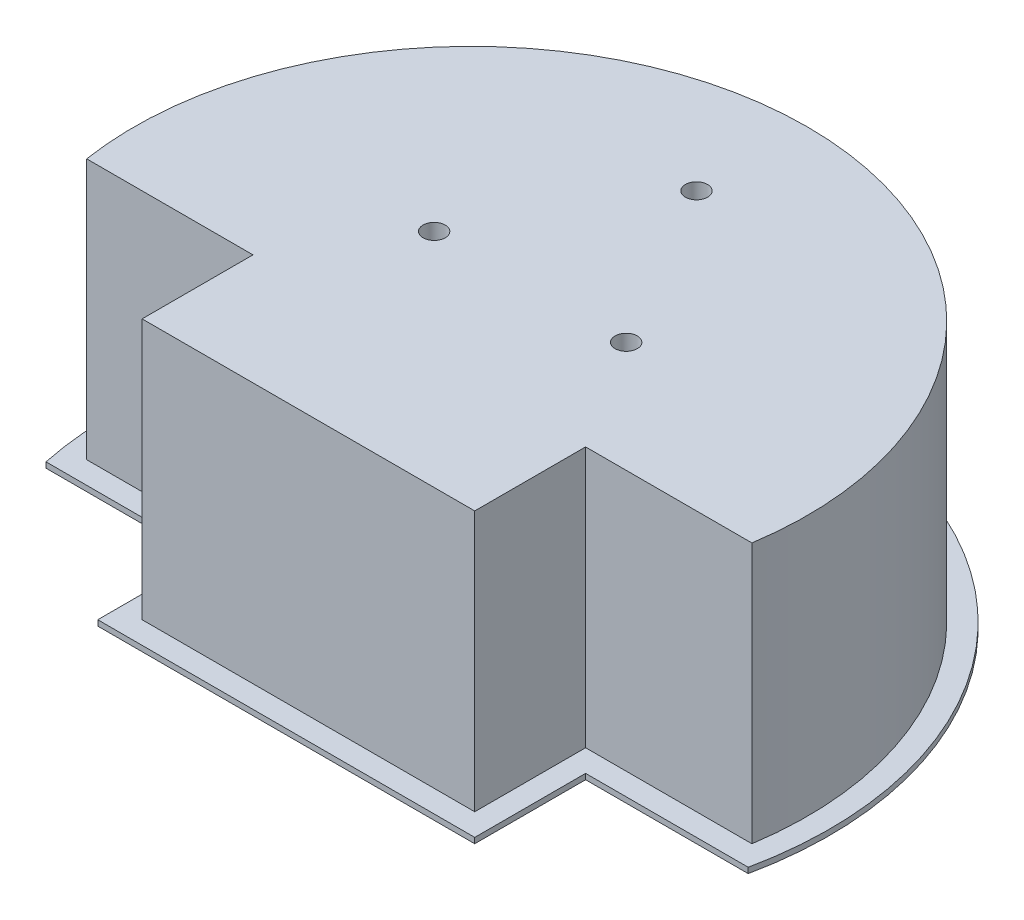
ISO-10303-21;
HEADER;
FILE_DESCRIPTION(('STEP AP214'),'2;1');
FILE_NAME('part.step','',(''),(''),'','','');
FILE_SCHEMA(('AUTOMOTIVE_DESIGN { 1 0 10303 214 1 1 1 1 }'));
ENDSEC;
DATA;
#1=APPLICATION_CONTEXT('core data for automotive mechanical design processes');
#2=APPLICATION_PROTOCOL_DEFINITION('international standard','automotive_design',2000,#1);
#3=PRODUCT_CONTEXT('',#1,'mechanical');
#4=PRODUCT('Part','Part','',(#3));
#5=PRODUCT_RELATED_PRODUCT_CATEGORY('part','',(#4));
#6=PRODUCT_DEFINITION_FORMATION('','',#4);
#7=PRODUCT_DEFINITION_CONTEXT('part definition',#1,'design');
#8=PRODUCT_DEFINITION('design','',#6,#7);
#9=PRODUCT_DEFINITION_SHAPE('','',#8);
#10=(LENGTH_UNIT() NAMED_UNIT(*) SI_UNIT(.MILLI.,.METRE.));
#11=(NAMED_UNIT(*) PLANE_ANGLE_UNIT() SI_UNIT($,.RADIAN.));
#12=(NAMED_UNIT(*) SI_UNIT($,.STERADIAN.) SOLID_ANGLE_UNIT());
#13=UNCERTAINTY_MEASURE_WITH_UNIT(LENGTH_MEASURE(1.E-05),#10,'distance_accuracy_value','');
#14=(GEOMETRIC_REPRESENTATION_CONTEXT(3) GLOBAL_UNCERTAINTY_ASSIGNED_CONTEXT((#13)) GLOBAL_UNIT_ASSIGNED_CONTEXT((#10,
#11,#12)) REPRESENTATION_CONTEXT('',''));
#15=CARTESIAN_POINT('',(0.,0.,0.));
#16=DIRECTION('',(0.,0.,1.));
#17=DIRECTION('',(1.,0.,0.));
#18=AXIS2_PLACEMENT_3D('',#15,#16,#17);
#19=CARTESIAN_POINT('',(0.,0.,-14.6428571428571));
#20=DIRECTION('',(0.,1.,0.));
#21=DIRECTION('',(0.,0.,1.));
#22=AXIS2_PLACEMENT_3D('',#19,#20,#21);
#23=PLANE('',#22);
#24=DIRECTION('',(0.,0.,1.));
#25=VECTOR('',#24,1.);
#26=CARTESIAN_POINT('',(-13.,0.,-14.6428571428571));
#27=LINE('',#26,#25);
#28=CARTESIAN_POINT('',(-13.,0.,-12.));
#29=VERTEX_POINT('',#28);
#30=CARTESIAN_POINT('',(-13.,0.,-2.));
#31=VERTEX_POINT('',#30);
#32=EDGE_CURVE('E355',#29,#31,#27,.T.);
#33=ORIENTED_EDGE('',*,*,#32,.T.);
#34=DIRECTION('',(1.,0.,0.));
#35=VECTOR('',#34,1.);
#36=CARTESIAN_POINT('',(0.,0.,-2.));
#37=LINE('',#36,#35);
#38=CARTESIAN_POINT('',(13.,0.,-2.));
#39=VERTEX_POINT('',#38);
#40=EDGE_CURVE('E385',#31,#39,#37,.T.);
#41=ORIENTED_EDGE('',*,*,#40,.T.);
#42=DIRECTION('',(0.,0.,-1.));
#43=VECTOR('',#42,1.);
#44=CARTESIAN_POINT('',(13.,0.,-14.6428571428571));
#45=LINE('',#44,#43);
#46=CARTESIAN_POINT('',(13.,0.,-12.));
#47=VERTEX_POINT('',#46);
#48=EDGE_CURVE('E389',#39,#47,#45,.T.);
#49=ORIENTED_EDGE('',*,*,#48,.T.);
#50=DIRECTION('',(1.,0.,0.));
#51=VECTOR('',#50,1.);
#52=CARTESIAN_POINT('',(0.,0.,-12.));
#53=LINE('',#52,#51);
#54=CARTESIAN_POINT('',(28.2337184434296,0.,-12.));
#55=VERTEX_POINT('',#54);
#56=EDGE_CURVE('E393',#47,#55,#53,.T.);
#57=ORIENTED_EDGE('',*,*,#56,.T.);
#58=CARTESIAN_POINT('',(0.,0.,-14.6428571428571));
#59=DIRECTION('',(0.,-1.,0.));
#60=DIRECTION('',(-1.,0.,0.));
#61=AXIS2_PLACEMENT_3D('',#58,#59,#60);
#62=CIRCLE('',#61,28.3571428571429);
#63=CARTESIAN_POINT('',(-28.2337184434296,0.,-12.));
#64=VERTEX_POINT('',#63);
#65=EDGE_CURVE('E397',#55,#64,#62,.F.);
#66=ORIENTED_EDGE('',*,*,#65,.T.);
#67=DIRECTION('',(1.,0.,0.));
#68=VECTOR('',#67,1.);
#69=CARTESIAN_POINT('',(0.,0.,-12.));
#70=LINE('',#69,#68);
#71=EDGE_CURVE('E361',#64,#29,#70,.T.);
#72=ORIENTED_EDGE('',*,*,#71,.T.);
#73=EDGE_LOOP('',(#33,#41,#49,#57,#66,#72));
#74=FACE_BOUND('',#73,.T.);
#75=DIRECTION('',(0.,0.,1.));
#76=VECTOR('',#75,1.);
#77=CARTESIAN_POINT('',(17.,0.,-8.00000000000001));
#78=LINE('',#77,#76);
#79=CARTESIAN_POINT('',(17.,0.,-8.00000000000001));
#80=VERTEX_POINT('',#79);
#81=CARTESIAN_POINT('',(17.,0.,2.));
#82=VERTEX_POINT('',#81);
#83=EDGE_CURVE('E258',#80,#82,#78,.T.);
#84=ORIENTED_EDGE('',*,*,#83,.T.);
#85=DIRECTION('',(-1.,0.,0.));
#86=VECTOR('',#85,1.);
#87=CARTESIAN_POINT('',(17.,0.,2.));
#88=LINE('',#87,#86);
#89=CARTESIAN_POINT('',(-17.,0.,2.));
#90=VERTEX_POINT('',#89);
#91=EDGE_CURVE('E211',#82,#90,#88,.T.);
#92=ORIENTED_EDGE('',*,*,#91,.T.);
#93=DIRECTION('',(0.,0.,-1.));
#94=VECTOR('',#93,1.);
#95=CARTESIAN_POINT('',(-17.,0.,2.));
#96=LINE('',#95,#94);
#97=CARTESIAN_POINT('',(-17.,0.,-8.));
#98=VERTEX_POINT('',#97);
#99=EDGE_CURVE('E263',#90,#98,#96,.T.);
#100=ORIENTED_EDGE('',*,*,#99,.T.);
#101=DIRECTION('',(-1.,0.,0.));
#102=VECTOR('',#101,1.);
#103=CARTESIAN_POINT('',(-17.,0.,-8.));
#104=LINE('',#103,#102);
#105=CARTESIAN_POINT('',(-31.6679197747049,0.,-8.));
#106=VERTEX_POINT('',#105);
#107=EDGE_CURVE('E267',#98,#106,#104,.T.);
#108=ORIENTED_EDGE('',*,*,#107,.T.);
#109=CARTESIAN_POINT('',(0.,0.,-14.6428571428571));
#110=DIRECTION('',(0.,-1.,0.));
#111=DIRECTION('',(0.,0.,-1.));
#112=AXIS2_PLACEMENT_3D('',#109,#110,#111);
#113=CIRCLE('',#112,32.3571428571429);
#114=CARTESIAN_POINT('',(31.6679197747049,0.,-8.00000000000001));
#115=VERTEX_POINT('',#114);
#116=EDGE_CURVE('E240',#106,#115,#113,.T.);
#117=ORIENTED_EDGE('',*,*,#116,.T.);
#118=DIRECTION('',(-1.,0.,0.));
#119=VECTOR('',#118,1.);
#120=CARTESIAN_POINT('',(31.6679197747049,0.,-8.00000000000001));
#121=LINE('',#120,#119);
#122=EDGE_CURVE('E236',#115,#80,#121,.T.);
#123=ORIENTED_EDGE('',*,*,#122,.T.);
#124=EDGE_LOOP('',(#84,#92,#100,#108,#117,#123));
#125=FACE_BOUND('',#124,.T.);
#126=ADVANCED_FACE('F78',(#74,#125),#23,.F.);
#127=CARTESIAN_POINT('',(-13.,20.,-14.6428571428571));
#128=DIRECTION('',(1.,0.,0.));
#129=DIRECTION('',(0.,0.,-1.));
#130=AXIS2_PLACEMENT_3D('',#127,#128,#129);
#131=PLANE('',#130);
#132=ORIENTED_EDGE('',*,*,#32,.F.);
#133=DIRECTION('',(0.,-1.,0.));
#134=VECTOR('',#133,1.);
#135=CARTESIAN_POINT('',(-13.,20.,-12.));
#136=LINE('',#135,#134);
#137=CARTESIAN_POINT('',(-13.,20.,-12.));
#138=VERTEX_POINT('',#137);
#139=EDGE_CURVE('E381',#138,#29,#136,.T.);
#140=ORIENTED_EDGE('',*,*,#139,.F.);
#141=DIRECTION('',(0.,0.,1.));
#142=VECTOR('',#141,1.);
#143=CARTESIAN_POINT('',(-13.,20.,-14.6428571428571));
#144=LINE('',#143,#142);
#145=CARTESIAN_POINT('',(-13.,20.,-2.));
#146=VERTEX_POINT('',#145);
#147=EDGE_CURVE('E356',#138,#146,#144,.T.);
#148=ORIENTED_EDGE('',*,*,#147,.T.);
#149=DIRECTION('',(0.,-1.,0.));
#150=VECTOR('',#149,1.);
#151=CARTESIAN_POINT('',(-13.,20.,-2.));
#152=LINE('',#151,#150);
#153=EDGE_CURVE('E418',#146,#31,#152,.T.);
#154=ORIENTED_EDGE('',*,*,#153,.T.);
#155=EDGE_LOOP('',(#132,#140,#148,#154));
#156=FACE_BOUND('',#155,.T.);
#157=ADVANCED_FACE('F482',(#156),#131,.T.);
#158=CARTESIAN_POINT('',(0.,20.,-2.));
#159=DIRECTION('',(0.,0.,-1.));
#160=DIRECTION('',(-1.,0.,0.));
#161=AXIS2_PLACEMENT_3D('',#158,#159,#160);
#162=PLANE('',#161);
#163=ORIENTED_EDGE('',*,*,#40,.F.);
#164=ORIENTED_EDGE('',*,*,#153,.F.);
#165=DIRECTION('',(1.,0.,0.));
#166=VECTOR('',#165,1.);
#167=CARTESIAN_POINT('',(0.,20.,-2.));
#168=LINE('',#167,#166);
#169=CARTESIAN_POINT('',(13.,20.,-2.));
#170=VERTEX_POINT('',#169);
#171=EDGE_CURVE('E360',#146,#170,#168,.T.);
#172=ORIENTED_EDGE('',*,*,#171,.T.);
#173=DIRECTION('',(0.,-1.,0.));
#174=VECTOR('',#173,1.);
#175=CARTESIAN_POINT('',(13.,20.,-2.));
#176=LINE('',#175,#174);
#177=EDGE_CURVE('E415',#170,#39,#176,.T.);
#178=ORIENTED_EDGE('',*,*,#177,.T.);
#179=EDGE_LOOP('',(#163,#164,#172,#178));
#180=FACE_BOUND('',#179,.T.);
#181=ADVANCED_FACE('F484',(#180),#162,.T.);
#182=CARTESIAN_POINT('',(13.,20.,-14.6428571428571));
#183=DIRECTION('',(-1.,0.,0.));
#184=DIRECTION('',(0.,0.,1.));
#185=AXIS2_PLACEMENT_3D('',#182,#183,#184);
#186=PLANE('',#185);
#187=ORIENTED_EDGE('',*,*,#48,.F.);
#188=ORIENTED_EDGE('',*,*,#177,.F.);
#189=DIRECTION('',(0.,0.,-1.));
#190=VECTOR('',#189,1.);
#191=CARTESIAN_POINT('',(13.,20.,-14.6428571428571));
#192=LINE('',#191,#190);
#193=CARTESIAN_POINT('',(13.,20.,-12.));
#194=VERTEX_POINT('',#193);
#195=EDGE_CURVE('E365',#170,#194,#192,.T.);
#196=ORIENTED_EDGE('',*,*,#195,.T.);
#197=DIRECTION('',(0.,-1.,0.));
#198=VECTOR('',#197,1.);
#199=CARTESIAN_POINT('',(13.,20.,-12.));
#200=LINE('',#199,#198);
#201=EDGE_CURVE('E412',#194,#47,#200,.T.);
#202=ORIENTED_EDGE('',*,*,#201,.T.);
#203=EDGE_LOOP('',(#187,#188,#196,#202));
#204=FACE_BOUND('',#203,.T.);
#205=ADVANCED_FACE('F500',(#204),#186,.T.);
#206=CARTESIAN_POINT('',(0.,20.,-12.));
#207=DIRECTION('',(0.,0.,-1.));
#208=DIRECTION('',(-1.,0.,0.));
#209=AXIS2_PLACEMENT_3D('',#206,#207,#208);
#210=PLANE('',#209);
#211=ORIENTED_EDGE('',*,*,#56,.F.);
#212=ORIENTED_EDGE('',*,*,#201,.F.);
#213=DIRECTION('',(1.,0.,0.));
#214=VECTOR('',#213,1.);
#215=CARTESIAN_POINT('',(0.,20.,-12.));
#216=LINE('',#215,#214);
#217=CARTESIAN_POINT('',(28.2337184434296,20.,-12.));
#218=VERTEX_POINT('',#217);
#219=EDGE_CURVE('E369',#194,#218,#216,.T.);
#220=ORIENTED_EDGE('',*,*,#219,.T.);
#221=DIRECTION('',(0.,-1.,0.));
#222=VECTOR('',#221,1.);
#223=CARTESIAN_POINT('',(28.2337184434296,20.,-12.));
#224=LINE('',#223,#222);
#225=EDGE_CURVE('E409',#218,#55,#224,.T.);
#226=ORIENTED_EDGE('',*,*,#225,.T.);
#227=EDGE_LOOP('',(#211,#212,#220,#226));
#228=FACE_BOUND('',#227,.T.);
#229=ADVANCED_FACE('F497',(#228),#210,.T.);
#230=CARTESIAN_POINT('',(0.,20.,-14.6428571428571));
#231=DIRECTION('',(0.,-1.,0.));
#232=DIRECTION('',(0.,0.,-1.));
#233=AXIS2_PLACEMENT_3D('',#230,#231,#232);
#234=CYLINDRICAL_SURFACE('',#233,28.3571428571429);
#235=ORIENTED_EDGE('',*,*,#65,.F.);
#236=ORIENTED_EDGE('',*,*,#225,.F.);
#237=CARTESIAN_POINT('',(0.,20.,-14.6428571428571));
#238=DIRECTION('',(0.,-1.,0.));
#239=DIRECTION('',(-1.,0.,0.));
#240=AXIS2_PLACEMENT_3D('',#237,#238,#239);
#241=CIRCLE('',#240,28.3571428571429);
#242=CARTESIAN_POINT('',(-28.2337184434296,20.,-12.));
#243=VERTEX_POINT('',#242);
#244=EDGE_CURVE('E373',#218,#243,#241,.F.);
#245=ORIENTED_EDGE('',*,*,#244,.T.);
#246=DIRECTION('',(0.,-1.,0.));
#247=VECTOR('',#246,1.);
#248=CARTESIAN_POINT('',(-28.2337184434296,20.,-12.));
#249=LINE('',#248,#247);
#250=EDGE_CURVE('E406',#243,#64,#249,.T.);
#251=ORIENTED_EDGE('',*,*,#250,.T.);
#252=EDGE_LOOP('',(#235,#236,#245,#251));
#253=FACE_BOUND('',#252,.T.);
#254=ADVANCED_FACE('F498',(#253),#234,.F.);
#255=CARTESIAN_POINT('',(0.,20.,-12.));
#256=DIRECTION('',(0.,0.,-1.));
#257=DIRECTION('',(-1.,0.,0.));
#258=AXIS2_PLACEMENT_3D('',#255,#256,#257);
#259=PLANE('',#258);
#260=ORIENTED_EDGE('',*,*,#71,.F.);
#261=ORIENTED_EDGE('',*,*,#250,.F.);
#262=DIRECTION('',(1.,0.,0.));
#263=VECTOR('',#262,1.);
#264=CARTESIAN_POINT('',(0.,20.,-12.));
#265=LINE('',#264,#263);
#266=EDGE_CURVE('E377',#243,#138,#265,.T.);
#267=ORIENTED_EDGE('',*,*,#266,.T.);
#268=ORIENTED_EDGE('',*,*,#139,.T.);
#269=EDGE_LOOP('',(#260,#261,#267,#268));
#270=FACE_BOUND('',#269,.T.);
#271=ADVANCED_FACE('F473',(#270),#259,.T.);
#272=CARTESIAN_POINT('',(0.,20.,-14.6428571428571));
#273=DIRECTION('',(0.,1.,0.));
#274=DIRECTION('',(0.,0.,1.));
#275=AXIS2_PLACEMENT_3D('',#272,#273,#274);
#276=PLANE('',#275);
#277=CARTESIAN_POINT('',(-8.66025403784439,20.,-20.));
#278=DIRECTION('',(0.,-1.,0.));
#279=DIRECTION('',(0.,0.,-1.));
#280=AXIS2_PLACEMENT_3D('',#277,#278,#279);
#281=CIRCLE('',#280,2.1);
#282=CARTESIAN_POINT('',(-8.66025403784439,20.,-22.1));
#283=VERTEX_POINT('',#282);
#284=EDGE_CURVE('E313',#283,#283,#281,.T.);
#285=ORIENTED_EDGE('',*,*,#284,.F.);
#286=EDGE_LOOP('',(#285));
#287=FACE_BOUND('',#286,.T.);
#288=CARTESIAN_POINT('',(8.66025403784439,20.,-20.));
#289=DIRECTION('',(0.,-1.,0.));
#290=DIRECTION('',(0.,0.,-1.));
#291=AXIS2_PLACEMENT_3D('',#288,#289,#290);
#292=CIRCLE('',#291,2.1);
#293=CARTESIAN_POINT('',(8.66025403784439,20.,-22.1));
#294=VERTEX_POINT('',#293);
#295=EDGE_CURVE('E317',#294,#294,#292,.T.);
#296=ORIENTED_EDGE('',*,*,#295,.F.);
#297=EDGE_LOOP('',(#296));
#298=FACE_BOUND('',#297,.T.);
#299=CARTESIAN_POINT('',(0.,20.,-35.));
#300=DIRECTION('',(0.,-1.,0.));
#301=DIRECTION('',(0.,0.,-1.));
#302=AXIS2_PLACEMENT_3D('',#299,#300,#301);
#303=CIRCLE('',#302,2.1);
#304=CARTESIAN_POINT('',(0.,20.,-37.1));
#305=VERTEX_POINT('',#304);
#306=EDGE_CURVE('E325',#305,#305,#303,.T.);
#307=ORIENTED_EDGE('',*,*,#306,.F.);
#308=EDGE_LOOP('',(#307));
#309=FACE_BOUND('',#308,.T.);
#310=ORIENTED_EDGE('',*,*,#171,.F.);
#311=ORIENTED_EDGE('',*,*,#147,.F.);
#312=ORIENTED_EDGE('',*,*,#266,.F.);
#313=ORIENTED_EDGE('',*,*,#244,.F.);
#314=ORIENTED_EDGE('',*,*,#219,.F.);
#315=ORIENTED_EDGE('',*,*,#195,.F.);
#316=EDGE_LOOP('',(#310,#311,#312,#313,#314,#315));
#317=FACE_BOUND('',#316,.T.);
#318=ADVANCED_FACE('F467',(#287,#298,#309,#317),#276,.F.);
#319=CARTESIAN_POINT('',(0.,22.2,-35.));
#320=DIRECTION('',(0.,-1.,0.));
#321=DIRECTION('',(0.,0.,-1.));
#322=AXIS2_PLACEMENT_3D('',#319,#320,#321);
#323=CYLINDRICAL_SURFACE('',#322,2.1);
#324=CARTESIAN_POINT('',(0.,22.2,-35.));
#325=DIRECTION('',(0.,-1.,0.));
#326=DIRECTION('',(0.,0.,-1.));
#327=AXIS2_PLACEMENT_3D('',#324,#325,#326);
#328=CIRCLE('',#327,2.1);
#329=CARTESIAN_POINT('',(0.,22.2,-37.1));
#330=VERTEX_POINT('',#329);
#331=EDGE_CURVE('E307',#330,#330,#328,.T.);
#332=ORIENTED_EDGE('',*,*,#331,.F.);
#333=EDGE_LOOP('',(#332));
#334=FACE_BOUND('',#333,.T.);
#335=ORIENTED_EDGE('',*,*,#306,.T.);
#336=EDGE_LOOP('',(#335));
#337=FACE_BOUND('',#336,.T.);
#338=ADVANCED_FACE('F461',(#334,#337),#323,.F.);
#339=CARTESIAN_POINT('',(0.,22.2,-35.));
#340=DIRECTION('',(0.,-1.,0.));
#341=DIRECTION('',(0.,0.,-1.));
#342=AXIS2_PLACEMENT_3D('',#339,#340,#341);
#343=PLANE('',#342);
#344=CARTESIAN_POINT('',(0.,22.2,-35.));
#345=DIRECTION('',(0.,-1.,0.));
#346=DIRECTION('',(0.,0.,-1.));
#347=AXIS2_PLACEMENT_3D('',#344,#345,#346);
#348=CIRCLE('',#347,1.);
#349=CARTESIAN_POINT('',(0.,22.2,-36.));
#350=VERTEX_POINT('',#349);
#351=EDGE_CURVE('E440',#350,#350,#348,.T.);
#352=ORIENTED_EDGE('',*,*,#351,.F.);
#353=EDGE_LOOP('',(#352));
#354=FACE_BOUND('',#353,.T.);
#355=ORIENTED_EDGE('',*,*,#331,.T.);
#356=EDGE_LOOP('',(#355));
#357=FACE_BOUND('',#356,.T.);
#358=ADVANCED_FACE('F457',(#354,#357),#343,.T.);
#359=CARTESIAN_POINT('',(8.66025403784439,22.2,-20.));
#360=DIRECTION('',(0.,-1.,0.));
#361=DIRECTION('',(0.,0.,-1.));
#362=AXIS2_PLACEMENT_3D('',#359,#360,#361);
#363=CYLINDRICAL_SURFACE('',#362,2.1);
#364=CARTESIAN_POINT('',(8.66025403784439,22.2,-20.));
#365=DIRECTION('',(0.,-1.,0.));
#366=DIRECTION('',(0.,0.,-1.));
#367=AXIS2_PLACEMENT_3D('',#364,#365,#366);
#368=CIRCLE('',#367,2.1);
#369=CARTESIAN_POINT('',(8.66025403784439,22.2,-22.1));
#370=VERTEX_POINT('',#369);
#371=EDGE_CURVE('E321',#370,#370,#368,.T.);
#372=ORIENTED_EDGE('',*,*,#371,.F.);
#373=EDGE_LOOP('',(#372));
#374=FACE_BOUND('',#373,.T.);
#375=ORIENTED_EDGE('',*,*,#295,.T.);
#376=EDGE_LOOP('',(#375));
#377=FACE_BOUND('',#376,.T.);
#378=ADVANCED_FACE('F460',(#374,#377),#363,.F.);
#379=CARTESIAN_POINT('',(8.66025403784439,22.2,-20.));
#380=DIRECTION('',(0.,-1.,0.));
#381=DIRECTION('',(0.,0.,-1.));
#382=AXIS2_PLACEMENT_3D('',#379,#380,#381);
#383=PLANE('',#382);
#384=CARTESIAN_POINT('',(8.66025403784439,22.2,-20.));
#385=DIRECTION('',(0.,-1.,0.));
#386=DIRECTION('',(0.,0.,-1.));
#387=AXIS2_PLACEMENT_3D('',#384,#385,#386);
#388=CIRCLE('',#387,1.);
#389=CARTESIAN_POINT('',(8.66025403784439,22.2,-21.));
#390=VERTEX_POINT('',#389);
#391=EDGE_CURVE('E444',#390,#390,#388,.T.);
#392=ORIENTED_EDGE('',*,*,#391,.F.);
#393=EDGE_LOOP('',(#392));
#394=FACE_BOUND('',#393,.T.);
#395=ORIENTED_EDGE('',*,*,#371,.T.);
#396=EDGE_LOOP('',(#395));
#397=FACE_BOUND('',#396,.T.);
#398=ADVANCED_FACE('F579',(#394,#397),#383,.T.);
#399=CARTESIAN_POINT('',(-8.66025403784439,22.2,-20.));
#400=DIRECTION('',(0.,-1.,0.));
#401=DIRECTION('',(0.,0.,-1.));
#402=AXIS2_PLACEMENT_3D('',#399,#400,#401);
#403=CYLINDRICAL_SURFACE('',#402,2.1);
#404=CARTESIAN_POINT('',(-8.66025403784439,22.2,-20.));
#405=DIRECTION('',(0.,-1.,0.));
#406=DIRECTION('',(0.,0.,-1.));
#407=AXIS2_PLACEMENT_3D('',#404,#405,#406);
#408=CIRCLE('',#407,2.1);
#409=CARTESIAN_POINT('',(-8.66025403784439,22.2,-22.1));
#410=VERTEX_POINT('',#409);
#411=EDGE_CURVE('E308',#410,#410,#408,.T.);
#412=ORIENTED_EDGE('',*,*,#411,.F.);
#413=EDGE_LOOP('',(#412));
#414=FACE_BOUND('',#413,.T.);
#415=ORIENTED_EDGE('',*,*,#284,.T.);
#416=EDGE_LOOP('',(#415));
#417=FACE_BOUND('',#416,.T.);
#418=ADVANCED_FACE('F575',(#414,#417),#403,.F.);
#419=CARTESIAN_POINT('',(-8.66025403784439,22.2,-20.));
#420=DIRECTION('',(0.,-1.,0.));
#421=DIRECTION('',(0.,0.,-1.));
#422=AXIS2_PLACEMENT_3D('',#419,#420,#421);
#423=PLANE('',#422);
#424=CARTESIAN_POINT('',(-8.66025403784439,22.2,-20.));
#425=DIRECTION('',(0.,-1.,0.));
#426=DIRECTION('',(0.,0.,-1.));
#427=AXIS2_PLACEMENT_3D('',#424,#425,#426);
#428=CIRCLE('',#427,1.);
#429=CARTESIAN_POINT('',(-8.66025403784439,22.2,-21.));
#430=VERTEX_POINT('',#429);
#431=EDGE_CURVE('E243',#430,#430,#428,.T.);
#432=ORIENTED_EDGE('',*,*,#431,.F.);
#433=EDGE_LOOP('',(#432));
#434=FACE_BOUND('',#433,.T.);
#435=ORIENTED_EDGE('',*,*,#411,.T.);
#436=EDGE_LOOP('',(#435));
#437=FACE_BOUND('',#436,.T.);
#438=ADVANCED_FACE('F552',(#434,#437),#423,.T.);
#439=CARTESIAN_POINT('',(0.,0.5,-14.6428571428571));
#440=DIRECTION('',(0.,-1.,0.));
#441=DIRECTION('',(0.,0.,-1.));
#442=AXIS2_PLACEMENT_3D('',#439,#440,#441);
#443=PLANE('',#442);
#444=DIRECTION('',(0.,0.,1.));
#445=VECTOR('',#444,1.);
#446=CARTESIAN_POINT('',(17.,0.5,-8.00000000000001));
#447=LINE('',#446,#445);
#448=CARTESIAN_POINT('',(17.,0.5,-8.00000000000001));
#449=VERTEX_POINT('',#448);
#450=CARTESIAN_POINT('',(17.,0.5,2.));
#451=VERTEX_POINT('',#450);
#452=EDGE_CURVE('E226',#449,#451,#447,.T.);
#453=ORIENTED_EDGE('',*,*,#452,.F.);
#454=DIRECTION('',(-1.,0.,0.));
#455=VECTOR('',#454,1.);
#456=CARTESIAN_POINT('',(31.6679197747049,0.5,-8.00000000000001));
#457=LINE('',#456,#455);
#458=CARTESIAN_POINT('',(31.6679197747049,0.5,-8.00000000000001));
#459=VERTEX_POINT('',#458);
#460=EDGE_CURVE('E218',#459,#449,#457,.T.);
#461=ORIENTED_EDGE('',*,*,#460,.F.);
#462=CARTESIAN_POINT('',(0.,0.5,-14.6428571428571));
#463=DIRECTION('',(0.,-1.,0.));
#464=DIRECTION('',(0.,0.,-1.));
#465=AXIS2_PLACEMENT_3D('',#462,#463,#464);
#466=CIRCLE('',#465,32.3571428571429);
#467=CARTESIAN_POINT('',(-31.6679197747049,0.5,-8.));
#468=VERTEX_POINT('',#467);
#469=EDGE_CURVE('E252',#468,#459,#466,.T.);
#470=ORIENTED_EDGE('',*,*,#469,.F.);
#471=DIRECTION('',(-1.,0.,0.));
#472=VECTOR('',#471,1.);
#473=CARTESIAN_POINT('',(-17.,0.5,-8.));
#474=LINE('',#473,#472);
#475=CARTESIAN_POINT('',(-17.,0.5,-8.));
#476=VERTEX_POINT('',#475);
#477=EDGE_CURVE('E248',#476,#468,#474,.T.);
#478=ORIENTED_EDGE('',*,*,#477,.F.);
#479=DIRECTION('',(0.,0.,-1.));
#480=VECTOR('',#479,1.);
#481=CARTESIAN_POINT('',(-17.,0.5,2.));
#482=LINE('',#481,#480);
#483=CARTESIAN_POINT('',(-17.,0.5,2.));
#484=VERTEX_POINT('',#483);
#485=EDGE_CURVE('E230',#484,#476,#482,.T.);
#486=ORIENTED_EDGE('',*,*,#485,.F.);
#487=DIRECTION('',(-1.,0.,0.));
#488=VECTOR('',#487,1.);
#489=CARTESIAN_POINT('',(17.,0.5,2.));
#490=LINE('',#489,#488);
#491=EDGE_CURVE('E209',#451,#484,#490,.T.);
#492=ORIENTED_EDGE('',*,*,#491,.F.);
#493=EDGE_LOOP('',(#453,#461,#470,#478,#486,#492));
#494=FACE_BOUND('',#493,.T.);
#495=DIRECTION('',(-1.,0.,0.));
#496=VECTOR('',#495,1.);
#497=CARTESIAN_POINT('',(-15.,0.5,0.));
#498=LINE('',#497,#496);
#499=CARTESIAN_POINT('',(15.,0.5,0.));
#500=VERTEX_POINT('',#499);
#501=CARTESIAN_POINT('',(-15.,0.5,0.));
#502=VERTEX_POINT('',#501);
#503=EDGE_CURVE('E102',#500,#502,#498,.T.);
#504=ORIENTED_EDGE('',*,*,#503,.T.);
#505=DIRECTION('',(0.,0.,-1.));
#506=VECTOR('',#505,1.);
#507=CARTESIAN_POINT('',(-15.,0.5,0.));
#508=LINE('',#507,#506);
#509=CARTESIAN_POINT('',(-15.,0.5,-10.));
#510=VERTEX_POINT('',#509);
#511=EDGE_CURVE('E96',#502,#510,#508,.T.);
#512=ORIENTED_EDGE('',*,*,#511,.T.);
#513=DIRECTION('',(-1.,0.,0.));
#514=VECTOR('',#513,1.);
#515=CARTESIAN_POINT('',(-15.,0.5,-10.));
#516=LINE('',#515,#514);
#517=CARTESIAN_POINT('',(-30.,0.5,-10.));
#518=VERTEX_POINT('',#517);
#519=EDGE_CURVE('E276',#510,#518,#516,.T.);
#520=ORIENTED_EDGE('',*,*,#519,.T.);
#521=CARTESIAN_POINT('',(0.,0.5,-14.6428571428571));
#522=DIRECTION('',(0.,-1.,0.));
#523=DIRECTION('',(0.,0.,-1.));
#524=AXIS2_PLACEMENT_3D('',#521,#522,#523);
#525=CIRCLE('',#524,30.3571428571429);
#526=CARTESIAN_POINT('',(30.,0.5,-10.));
#527=VERTEX_POINT('',#526);
#528=EDGE_CURVE('E291',#518,#527,#525,.T.);
#529=ORIENTED_EDGE('',*,*,#528,.T.);
#530=DIRECTION('',(-1.,0.,0.));
#531=VECTOR('',#530,1.);
#532=CARTESIAN_POINT('',(15.,0.5,-10.));
#533=LINE('',#532,#531);
#534=CARTESIAN_POINT('',(15.,0.5,-10.));
#535=VERTEX_POINT('',#534);
#536=EDGE_CURVE('E295',#527,#535,#533,.T.);
#537=ORIENTED_EDGE('',*,*,#536,.T.);
#538=DIRECTION('',(0.,0.,1.));
#539=VECTOR('',#538,1.);
#540=CARTESIAN_POINT('',(15.,0.5,0.));
#541=LINE('',#540,#539);
#542=EDGE_CURVE('E299',#535,#500,#541,.T.);
#543=ORIENTED_EDGE('',*,*,#542,.T.);
#544=EDGE_LOOP('',(#504,#512,#520,#529,#537,#543));
#545=FACE_BOUND('',#544,.T.);
#546=ADVANCED_FACE('F223',(#494,#545),#443,.F.);
#547=CARTESIAN_POINT('',(17.,0.5,-8.00000000000001));
#548=DIRECTION('',(1.,0.,0.));
#549=DIRECTION('',(0.,0.,-1.));
#550=AXIS2_PLACEMENT_3D('',#547,#548,#549);
#551=PLANE('',#550);
#552=ORIENTED_EDGE('',*,*,#83,.F.);
#553=DIRECTION('',(0.,-1.,0.));
#554=VECTOR('',#553,1.);
#555=CARTESIAN_POINT('',(17.,0.5,-8.00000000000001));
#556=LINE('',#555,#554);
#557=EDGE_CURVE('E234',#449,#80,#556,.T.);
#558=ORIENTED_EDGE('',*,*,#557,.F.);
#559=ORIENTED_EDGE('',*,*,#452,.T.);
#560=DIRECTION('',(0.,-1.,0.));
#561=VECTOR('',#560,1.);
#562=CARTESIAN_POINT('',(17.,0.5,2.));
#563=LINE('',#562,#561);
#564=EDGE_CURVE('E206',#451,#82,#563,.T.);
#565=ORIENTED_EDGE('',*,*,#564,.T.);
#566=EDGE_LOOP('',(#552,#558,#559,#565));
#567=FACE_BOUND('',#566,.T.);
#568=ADVANCED_FACE('F233',(#567),#551,.T.);
#569=CARTESIAN_POINT('',(31.6679197747049,0.5,-8.00000000000001));
#570=DIRECTION('',(0.,0.,1.));
#571=DIRECTION('',(1.,0.,0.));
#572=AXIS2_PLACEMENT_3D('',#569,#570,#571);
#573=PLANE('',#572);
#574=ORIENTED_EDGE('',*,*,#122,.F.);
#575=DIRECTION('',(0.,-1.,0.));
#576=VECTOR('',#575,1.);
#577=CARTESIAN_POINT('',(31.6679197747049,0.5,-8.00000000000001));
#578=LINE('',#577,#576);
#579=EDGE_CURVE('E277',#459,#115,#578,.T.);
#580=ORIENTED_EDGE('',*,*,#579,.F.);
#581=ORIENTED_EDGE('',*,*,#460,.T.);
#582=ORIENTED_EDGE('',*,*,#557,.T.);
#583=EDGE_LOOP('',(#574,#580,#581,#582));
#584=FACE_BOUND('',#583,.T.);
#585=ADVANCED_FACE('F553',(#584),#573,.T.);
#586=CARTESIAN_POINT('',(0.,0.5,-14.6428571428571));
#587=DIRECTION('',(0.,-1.,0.));
#588=DIRECTION('',(0.,0.,-1.));
#589=AXIS2_PLACEMENT_3D('',#586,#587,#588);
#590=CYLINDRICAL_SURFACE('',#589,32.3571428571429);
#591=ORIENTED_EDGE('',*,*,#116,.F.);
#592=DIRECTION('',(0.,-1.,0.));
#593=VECTOR('',#592,1.);
#594=CARTESIAN_POINT('',(-31.6679197747049,0.5,-8.));
#595=LINE('',#594,#593);
#596=EDGE_CURVE('E280',#468,#106,#595,.T.);
#597=ORIENTED_EDGE('',*,*,#596,.F.);
#598=ORIENTED_EDGE('',*,*,#469,.T.);
#599=ORIENTED_EDGE('',*,*,#579,.T.);
#600=EDGE_LOOP('',(#591,#597,#598,#599));
#601=FACE_BOUND('',#600,.T.);
#602=ADVANCED_FACE('F556',(#601),#590,.T.);
#603=CARTESIAN_POINT('',(-17.,0.5,-8.));
#604=DIRECTION('',(0.,0.,1.));
#605=DIRECTION('',(1.,0.,0.));
#606=AXIS2_PLACEMENT_3D('',#603,#604,#605);
#607=PLANE('',#606);
#608=ORIENTED_EDGE('',*,*,#107,.F.);
#609=DIRECTION('',(0.,-1.,0.));
#610=VECTOR('',#609,1.);
#611=CARTESIAN_POINT('',(-17.,0.5,-8.));
#612=LINE('',#611,#610);
#613=EDGE_CURVE('E283',#476,#98,#612,.T.);
#614=ORIENTED_EDGE('',*,*,#613,.F.);
#615=ORIENTED_EDGE('',*,*,#477,.T.);
#616=ORIENTED_EDGE('',*,*,#596,.T.);
#617=EDGE_LOOP('',(#608,#614,#615,#616));
#618=FACE_BOUND('',#617,.T.);
#619=ADVANCED_FACE('F560',(#618),#607,.T.);
#620=CARTESIAN_POINT('',(-17.,0.5,2.));
#621=DIRECTION('',(-1.,0.,0.));
#622=DIRECTION('',(0.,0.,1.));
#623=AXIS2_PLACEMENT_3D('',#620,#621,#622);
#624=PLANE('',#623);
#625=ORIENTED_EDGE('',*,*,#99,.F.);
#626=DIRECTION('',(0.,-1.,0.));
#627=VECTOR('',#626,1.);
#628=CARTESIAN_POINT('',(-17.,0.5,2.));
#629=LINE('',#628,#627);
#630=EDGE_CURVE('E217',#484,#90,#629,.T.);
#631=ORIENTED_EDGE('',*,*,#630,.F.);
#632=ORIENTED_EDGE('',*,*,#485,.T.);
#633=ORIENTED_EDGE('',*,*,#613,.T.);
#634=EDGE_LOOP('',(#625,#631,#632,#633));
#635=FACE_BOUND('',#634,.T.);
#636=ADVANCED_FACE('F564',(#635),#624,.T.);
#637=CARTESIAN_POINT('',(17.,0.5,2.));
#638=DIRECTION('',(0.,0.,1.));
#639=DIRECTION('',(1.,0.,0.));
#640=AXIS2_PLACEMENT_3D('',#637,#638,#639);
#641=PLANE('',#640);
#642=ORIENTED_EDGE('',*,*,#91,.F.);
#643=ORIENTED_EDGE('',*,*,#564,.F.);
#644=ORIENTED_EDGE('',*,*,#491,.T.);
#645=ORIENTED_EDGE('',*,*,#630,.T.);
#646=EDGE_LOOP('',(#642,#643,#644,#645));
#647=FACE_BOUND('',#646,.T.);
#648=ADVANCED_FACE('F208',(#647),#641,.T.);
#649=CARTESIAN_POINT('',(0.,24.,-14.6428571428571));
#650=DIRECTION('',(0.,1.,0.));
#651=DIRECTION('',(0.,0.,1.));
#652=AXIS2_PLACEMENT_3D('',#649,#650,#651);
#653=PLANE('',#652);
#654=CARTESIAN_POINT('',(-8.66025403784439,24.,-20.));
#655=DIRECTION('',(0.,1.,0.));
#656=DIRECTION('',(0.,0.,1.));
#657=AXIS2_PLACEMENT_3D('',#654,#655,#656);
#658=CIRCLE('',#657,1.);
#659=CARTESIAN_POINT('',(-8.66025403784439,24.,-19.));
#660=VERTEX_POINT('',#659);
#661=EDGE_CURVE('E82',#660,#660,#658,.T.);
#662=ORIENTED_EDGE('',*,*,#661,.F.);
#663=EDGE_LOOP('',(#662));
#664=FACE_BOUND('',#663,.T.);
#665=CARTESIAN_POINT('',(8.66025403784439,24.,-20.));
#666=DIRECTION('',(0.,1.,0.));
#667=DIRECTION('',(0.,0.,1.));
#668=AXIS2_PLACEMENT_3D('',#665,#666,#667);
#669=CIRCLE('',#668,1.);
#670=CARTESIAN_POINT('',(8.66025403784439,24.,-19.));
#671=VERTEX_POINT('',#670);
#672=EDGE_CURVE('E441',#671,#671,#669,.T.);
#673=ORIENTED_EDGE('',*,*,#672,.F.);
#674=EDGE_LOOP('',(#673));
#675=FACE_BOUND('',#674,.T.);
#676=CARTESIAN_POINT('',(0.,24.,-35.));
#677=DIRECTION('',(0.,1.,0.));
#678=DIRECTION('',(0.,0.,1.));
#679=AXIS2_PLACEMENT_3D('',#676,#677,#678);
#680=CIRCLE('',#679,1.);
#681=CARTESIAN_POINT('',(0.,24.,-34.));
#682=VERTEX_POINT('',#681);
#683=EDGE_CURVE('E437',#682,#682,#680,.T.);
#684=ORIENTED_EDGE('',*,*,#683,.F.);
#685=EDGE_LOOP('',(#684));
#686=FACE_BOUND('',#685,.T.);
#687=DIRECTION('',(0.,0.,-1.));
#688=VECTOR('',#687,1.);
#689=CARTESIAN_POINT('',(15.,24.,0.));
#690=LINE('',#689,#688);
#691=CARTESIAN_POINT('',(15.,24.,0.));
#692=VERTEX_POINT('',#691);
#693=CARTESIAN_POINT('',(15.,24.,-10.));
#694=VERTEX_POINT('',#693);
#695=EDGE_CURVE('E312',#692,#694,#690,.T.);
#696=ORIENTED_EDGE('',*,*,#695,.T.);
#697=DIRECTION('',(1.,0.,0.));
#698=VECTOR('',#697,1.);
#699=CARTESIAN_POINT('',(15.,24.,-10.));
#700=LINE('',#699,#698);
#701=CARTESIAN_POINT('',(30.,24.,-10.));
#702=VERTEX_POINT('',#701);
#703=EDGE_CURVE('E335',#694,#702,#700,.T.);
#704=ORIENTED_EDGE('',*,*,#703,.T.);
#705=CARTESIAN_POINT('',(0.,24.,-14.6428571428571));
#706=DIRECTION('',(0.,1.,0.));
#707=DIRECTION('',(0.,0.,1.));
#708=AXIS2_PLACEMENT_3D('',#705,#706,#707);
#709=CIRCLE('',#708,30.3571428571429);
#710=CARTESIAN_POINT('',(-30.,24.,-9.99999999999999));
#711=VERTEX_POINT('',#710);
#712=EDGE_CURVE('E339',#702,#711,#709,.T.);
#713=ORIENTED_EDGE('',*,*,#712,.T.);
#714=DIRECTION('',(1.,0.,0.));
#715=VECTOR('',#714,1.);
#716=CARTESIAN_POINT('',(-30.,24.,-9.99999999999998));
#717=LINE('',#716,#715);
#718=CARTESIAN_POINT('',(-15.,24.,-10.));
#719=VERTEX_POINT('',#718);
#720=EDGE_CURVE('E343',#711,#719,#717,.T.);
#721=ORIENTED_EDGE('',*,*,#720,.T.);
#722=DIRECTION('',(0.,0.,1.));
#723=VECTOR('',#722,1.);
#724=CARTESIAN_POINT('',(-15.,24.,-10.));
#725=LINE('',#724,#723);
#726=CARTESIAN_POINT('',(-15.,24.,0.));
#727=VERTEX_POINT('',#726);
#728=EDGE_CURVE('E347',#719,#727,#725,.T.);
#729=ORIENTED_EDGE('',*,*,#728,.T.);
#730=DIRECTION('',(1.,0.,0.));
#731=VECTOR('',#730,1.);
#732=CARTESIAN_POINT('',(-15.,24.,0.));
#733=LINE('',#732,#731);
#734=EDGE_CURVE('E351',#727,#692,#733,.T.);
#735=ORIENTED_EDGE('',*,*,#734,.T.);
#736=EDGE_LOOP('',(#696,#704,#713,#721,#729,#735));
#737=FACE_BOUND('',#736,.T.);
#738=ADVANCED_FACE('F520',(#664,#675,#686,#737),#653,.T.);
#739=CARTESIAN_POINT('',(-15.,20.,-10.));
#740=DIRECTION('',(0.,0.,-1.));
#741=DIRECTION('',(-1.,0.,0.));
#742=AXIS2_PLACEMENT_3D('',#739,#740,#741);
#743=PLANE('',#742);
#744=ORIENTED_EDGE('',*,*,#519,.F.);
#745=DIRECTION('',(0.,-1.,0.));
#746=VECTOR('',#745,1.);
#747=CARTESIAN_POINT('',(-15.,20.,-10.));
#748=LINE('',#747,#746);
#749=EDGE_CURVE('E421',#719,#510,#748,.T.);
#750=ORIENTED_EDGE('',*,*,#749,.F.);
#751=ORIENTED_EDGE('',*,*,#720,.F.);
#752=DIRECTION('',(0.,-1.,0.));
#753=VECTOR('',#752,1.);
#754=CARTESIAN_POINT('',(-30.,20.,-9.99999999999998));
#755=LINE('',#754,#753);
#756=EDGE_CURVE('E424',#711,#518,#755,.T.);
#757=ORIENTED_EDGE('',*,*,#756,.T.);
#758=EDGE_LOOP('',(#744,#750,#751,#757));
#759=FACE_BOUND('',#758,.T.);
#760=ADVANCED_FACE('F516',(#759),#743,.F.);
#761=CARTESIAN_POINT('',(0.,20.,-14.6428571428571));
#762=DIRECTION('',(0.,-1.,0.));
#763=DIRECTION('',(0.,0.,-1.));
#764=AXIS2_PLACEMENT_3D('',#761,#762,#763);
#765=CYLINDRICAL_SURFACE('',#764,30.3571428571429);
#766=ORIENTED_EDGE('',*,*,#528,.F.);
#767=ORIENTED_EDGE('',*,*,#756,.F.);
#768=ORIENTED_EDGE('',*,*,#712,.F.);
#769=DIRECTION('',(0.,-1.,0.));
#770=VECTOR('',#769,1.);
#771=CARTESIAN_POINT('',(30.,20.,-10.));
#772=LINE('',#771,#770);
#773=EDGE_CURVE('E427',#702,#527,#772,.T.);
#774=ORIENTED_EDGE('',*,*,#773,.T.);
#775=EDGE_LOOP('',(#766,#767,#768,#774));
#776=FACE_BOUND('',#775,.T.);
#777=ADVANCED_FACE('F519',(#776),#765,.T.);
#778=CARTESIAN_POINT('',(15.,20.,-10.));
#779=DIRECTION('',(0.,0.,-1.));
#780=DIRECTION('',(-1.,0.,0.));
#781=AXIS2_PLACEMENT_3D('',#778,#779,#780);
#782=PLANE('',#781);
#783=ORIENTED_EDGE('',*,*,#536,.F.);
#784=ORIENTED_EDGE('',*,*,#773,.F.);
#785=ORIENTED_EDGE('',*,*,#703,.F.);
#786=DIRECTION('',(0.,-1.,0.));
#787=VECTOR('',#786,1.);
#788=CARTESIAN_POINT('',(15.,20.,-10.));
#789=LINE('',#788,#787);
#790=EDGE_CURVE('E431',#694,#535,#789,.T.);
#791=ORIENTED_EDGE('',*,*,#790,.T.);
#792=EDGE_LOOP('',(#783,#784,#785,#791));
#793=FACE_BOUND('',#792,.T.);
#794=ADVANCED_FACE('F524',(#793),#782,.F.);
#795=CARTESIAN_POINT('',(15.,20.,0.));
#796=DIRECTION('',(-1.,0.,0.));
#797=DIRECTION('',(0.,0.,1.));
#798=AXIS2_PLACEMENT_3D('',#795,#796,#797);
#799=PLANE('',#798);
#800=ORIENTED_EDGE('',*,*,#542,.F.);
#801=ORIENTED_EDGE('',*,*,#790,.F.);
#802=ORIENTED_EDGE('',*,*,#695,.F.);
#803=DIRECTION('',(0.,-1.,0.));
#804=VECTOR('',#803,1.);
#805=CARTESIAN_POINT('',(15.,20.,0.));
#806=LINE('',#805,#804);
#807=EDGE_CURVE('E88',#692,#500,#806,.T.);
#808=ORIENTED_EDGE('',*,*,#807,.T.);
#809=EDGE_LOOP('',(#800,#801,#802,#808));
#810=FACE_BOUND('',#809,.T.);
#811=ADVANCED_FACE('F528',(#810),#799,.F.);
#812=CARTESIAN_POINT('',(-15.,20.,0.));
#813=DIRECTION('',(0.,0.,-1.));
#814=DIRECTION('',(-1.,0.,0.));
#815=AXIS2_PLACEMENT_3D('',#812,#813,#814);
#816=PLANE('',#815);
#817=ORIENTED_EDGE('',*,*,#503,.F.);
#818=ORIENTED_EDGE('',*,*,#807,.F.);
#819=ORIENTED_EDGE('',*,*,#734,.F.);
#820=DIRECTION('',(0.,-1.,0.));
#821=VECTOR('',#820,1.);
#822=CARTESIAN_POINT('',(-15.,20.,0.));
#823=LINE('',#822,#821);
#824=EDGE_CURVE('E12',#727,#502,#823,.T.);
#825=ORIENTED_EDGE('',*,*,#824,.T.);
#826=EDGE_LOOP('',(#817,#818,#819,#825));
#827=FACE_BOUND('',#826,.T.);
#828=ADVANCED_FACE('F531',(#827),#816,.F.);
#829=CARTESIAN_POINT('',(-15.,20.,0.));
#830=DIRECTION('',(1.,0.,0.));
#831=DIRECTION('',(0.,0.,-1.));
#832=AXIS2_PLACEMENT_3D('',#829,#830,#831);
#833=PLANE('',#832);
#834=ORIENTED_EDGE('',*,*,#511,.F.);
#835=ORIENTED_EDGE('',*,*,#824,.F.);
#836=ORIENTED_EDGE('',*,*,#728,.F.);
#837=ORIENTED_EDGE('',*,*,#749,.T.);
#838=EDGE_LOOP('',(#834,#835,#836,#837));
#839=FACE_BOUND('',#838,.T.);
#840=ADVANCED_FACE('F80',(#839),#833,.F.);
#841=CARTESIAN_POINT('',(0.,30.,-35.));
#842=DIRECTION('',(0.,-1.,0.));
#843=DIRECTION('',(0.,0.,-1.));
#844=AXIS2_PLACEMENT_3D('',#841,#842,#843);
#845=CYLINDRICAL_SURFACE('',#844,1.);
#846=ORIENTED_EDGE('',*,*,#351,.T.);
#847=EDGE_LOOP('',(#846));
#848=FACE_BOUND('',#847,.T.);
#849=ORIENTED_EDGE('',*,*,#683,.T.);
#850=EDGE_LOOP('',(#849));
#851=FACE_BOUND('',#850,.T.);
#852=ADVANCED_FACE('F454',(#848,#851),#845,.F.);
#853=CARTESIAN_POINT('',(8.66025403784439,30.,-20.));
#854=DIRECTION('',(0.,-1.,0.));
#855=DIRECTION('',(0.,0.,-1.));
#856=AXIS2_PLACEMENT_3D('',#853,#854,#855);
#857=CYLINDRICAL_SURFACE('',#856,1.);
#858=ORIENTED_EDGE('',*,*,#391,.T.);
#859=EDGE_LOOP('',(#858));
#860=FACE_BOUND('',#859,.T.);
#861=ORIENTED_EDGE('',*,*,#672,.T.);
#862=EDGE_LOOP('',(#861));
#863=FACE_BOUND('',#862,.T.);
#864=ADVANCED_FACE('F540',(#860,#863),#857,.F.);
#865=CARTESIAN_POINT('',(-8.66025403784439,30.,-20.));
#866=DIRECTION('',(0.,-1.,0.));
#867=DIRECTION('',(0.,0.,-1.));
#868=AXIS2_PLACEMENT_3D('',#865,#866,#867);
#869=CYLINDRICAL_SURFACE('',#868,1.);
#870=ORIENTED_EDGE('',*,*,#431,.T.);
#871=EDGE_LOOP('',(#870));
#872=FACE_BOUND('',#871,.T.);
#873=ORIENTED_EDGE('',*,*,#661,.T.);
#874=EDGE_LOOP('',(#873));
#875=FACE_BOUND('',#874,.T.);
#876=ADVANCED_FACE('F545',(#872,#875),#869,.F.);
#877=CLOSED_SHELL('',(#126,#157,#181,#205,#229,#254,#271,#318,#338,#358,#378,#398,#418,#438,
#546,#568,#585,#602,#619,#636,#648,#738,#760,#777,#794,#811,#828,#840,#852,#864,#876));
#878=MANIFOLD_SOLID_BREP('B2',#877);
#879=ADVANCED_BREP_SHAPE_REPRESENTATION('',(#18,#878),#14);
#880=SHAPE_DEFINITION_REPRESENTATION(#9,#879);
ENDSEC;
END-ISO-10303-21;
